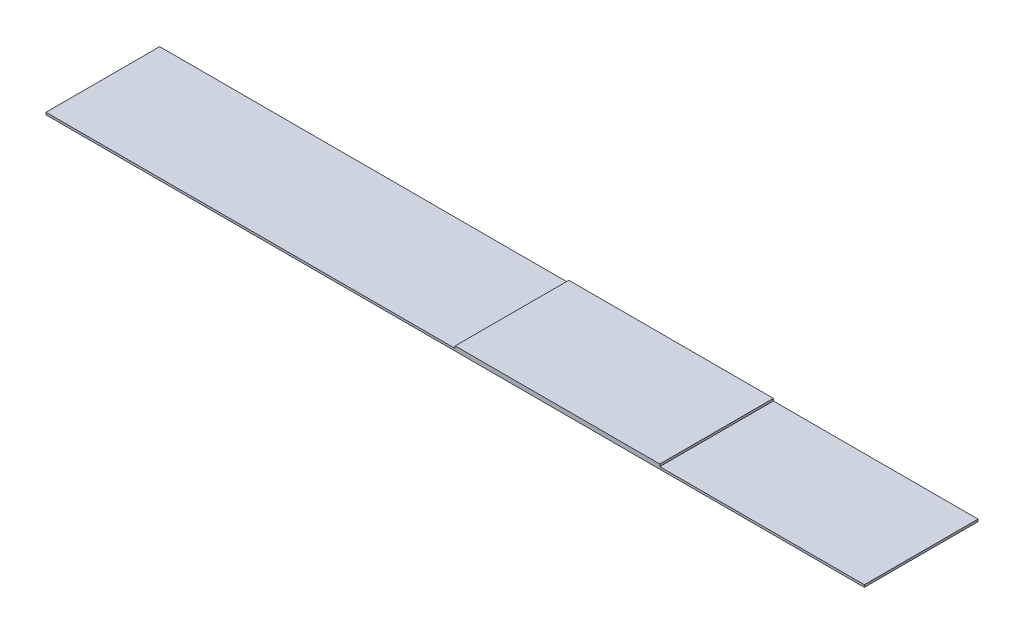
ISO-10303-21;
HEADER;
FILE_DESCRIPTION(('STEP AP214'),'2;1');
FILE_NAME('part.step','',(''),(''),'','','');
FILE_SCHEMA(('AUTOMOTIVE_DESIGN { 1 0 10303 214 1 1 1 1 }'));
ENDSEC;
DATA;
#1=APPLICATION_CONTEXT('core data for automotive mechanical design processes');
#2=APPLICATION_PROTOCOL_DEFINITION('international standard','automotive_design',2000,#1);
#3=PRODUCT_CONTEXT('',#1,'mechanical');
#4=PRODUCT('Part','Part','',(#3));
#5=PRODUCT_RELATED_PRODUCT_CATEGORY('part','',(#4));
#6=PRODUCT_DEFINITION_FORMATION('','',#4);
#7=PRODUCT_DEFINITION_CONTEXT('part definition',#1,'design');
#8=PRODUCT_DEFINITION('design','',#6,#7);
#9=PRODUCT_DEFINITION_SHAPE('','',#8);
#10=(LENGTH_UNIT() NAMED_UNIT(*) SI_UNIT(.MILLI.,.METRE.));
#11=(NAMED_UNIT(*) PLANE_ANGLE_UNIT() SI_UNIT($,.RADIAN.));
#12=(NAMED_UNIT(*) SI_UNIT($,.STERADIAN.) SOLID_ANGLE_UNIT());
#13=UNCERTAINTY_MEASURE_WITH_UNIT(LENGTH_MEASURE(1.E-05),#10,'distance_accuracy_value','');
#14=(GEOMETRIC_REPRESENTATION_CONTEXT(3) GLOBAL_UNCERTAINTY_ASSIGNED_CONTEXT((#13)) GLOBAL_UNIT_ASSIGNED_CONTEXT((#10,
#11,#12)) REPRESENTATION_CONTEXT('',''));
#15=CARTESIAN_POINT('',(0.,0.,0.));
#16=DIRECTION('',(0.,0.,1.));
#17=DIRECTION('',(1.,0.,0.));
#18=AXIS2_PLACEMENT_3D('',#15,#16,#17);
#19=CARTESIAN_POINT('',(0.,0.1,0.));
#20=DIRECTION('',(0.,-1.,0.));
#21=DIRECTION('',(0.,0.,-1.));
#22=AXIS2_PLACEMENT_3D('',#19,#20,#21);
#23=PLANE('',#22);
#24=DIRECTION('',(0.,0.,1.));
#25=VECTOR('',#24,1.);
#26=CARTESIAN_POINT('',(0.,0.1,-2.5));
#27=LINE('',#26,#25);
#28=CARTESIAN_POINT('',(0.,0.1,-2.5));
#29=VERTEX_POINT('',#28);
#30=CARTESIAN_POINT('',(0.,0.1,2.5));
#31=VERTEX_POINT('',#30);
#32=EDGE_CURVE('E120',#29,#31,#27,.T.);
#33=ORIENTED_EDGE('',*,*,#32,.F.);
#34=DIRECTION('',(-1.,0.,0.));
#35=VECTOR('',#34,1.);
#36=CARTESIAN_POINT('',(-18.,0.1,-2.5));
#37=LINE('',#36,#35);
#38=CARTESIAN_POINT('',(-18.,0.1,-2.5));
#39=VERTEX_POINT('',#38);
#40=EDGE_CURVE('E133',#29,#39,#37,.T.);
#41=ORIENTED_EDGE('',*,*,#40,.T.);
#42=DIRECTION('',(0.,0.,1.));
#43=VECTOR('',#42,1.);
#44=CARTESIAN_POINT('',(-18.,0.1,2.5));
#45=LINE('',#44,#43);
#46=CARTESIAN_POINT('',(-18.,0.1,2.5));
#47=VERTEX_POINT('',#46);
#48=EDGE_CURVE('E137',#39,#47,#45,.T.);
#49=ORIENTED_EDGE('',*,*,#48,.T.);
#50=DIRECTION('',(1.,0.,0.));
#51=VECTOR('',#50,1.);
#52=CARTESIAN_POINT('',(-18.,0.1,2.5));
#53=LINE('',#52,#51);
#54=EDGE_CURVE('E57',#47,#31,#53,.T.);
#55=ORIENTED_EDGE('',*,*,#54,.T.);
#56=EDGE_LOOP('',(#33,#41,#49,#55));
#57=FACE_BOUND('',#56,.T.);
#58=ADVANCED_FACE('F34',(#57),#23,.F.);
#59=DIRECTION('',(0.,0.,-1.));
#60=VECTOR('',#59,1.);
#61=CARTESIAN_POINT('',(9.,0.1,-2.5));
#62=LINE('',#61,#60);
#63=CARTESIAN_POINT('',(9.,0.1,2.5));
#64=VERTEX_POINT('',#63);
#65=CARTESIAN_POINT('',(9.,0.1,-2.5));
#66=VERTEX_POINT('',#65);
#67=EDGE_CURVE('E49',#64,#66,#62,.T.);
#68=ORIENTED_EDGE('',*,*,#67,.F.);
#69=CARTESIAN_POINT('',(18.,0.1,2.5));
#70=VERTEX_POINT('',#69);
#71=EDGE_CURVE('E139',#64,#70,#53,.T.);
#72=ORIENTED_EDGE('',*,*,#71,.T.);
#73=DIRECTION('',(0.,0.,-1.));
#74=VECTOR('',#73,1.);
#75=CARTESIAN_POINT('',(18.,0.1,2.5));
#76=LINE('',#75,#74);
#77=CARTESIAN_POINT('',(18.,0.1,-2.5));
#78=VERTEX_POINT('',#77);
#79=EDGE_CURVE('E130',#70,#78,#76,.T.);
#80=ORIENTED_EDGE('',*,*,#79,.T.);
#81=EDGE_CURVE('E135',#78,#66,#37,.T.);
#82=ORIENTED_EDGE('',*,*,#81,.T.);
#83=EDGE_LOOP('',(#68,#72,#80,#82));
#84=FACE_BOUND('',#83,.T.);
#85=ADVANCED_FACE('F167',(#84),#23,.F.);
#86=CARTESIAN_POINT('',(18.,0.1,2.5));
#87=DIRECTION('',(-1.,0.,0.));
#88=DIRECTION('',(0.,0.,1.));
#89=AXIS2_PLACEMENT_3D('',#86,#87,#88);
#90=PLANE('',#89);
#91=DIRECTION('',(0.,0.,-1.));
#92=VECTOR('',#91,1.);
#93=CARTESIAN_POINT('',(18.,0.,2.5));
#94=LINE('',#93,#92);
#95=CARTESIAN_POINT('',(18.,0.,2.5));
#96=VERTEX_POINT('',#95);
#97=CARTESIAN_POINT('',(18.,0.,-2.5));
#98=VERTEX_POINT('',#97);
#99=EDGE_CURVE('E121',#96,#98,#94,.T.);
#100=ORIENTED_EDGE('',*,*,#99,.T.);
#101=DIRECTION('',(0.,-1.,0.));
#102=VECTOR('',#101,1.);
#103=CARTESIAN_POINT('',(18.,0.1,-2.5));
#104=LINE('',#103,#102);
#105=EDGE_CURVE('E11',#78,#98,#104,.T.);
#106=ORIENTED_EDGE('',*,*,#105,.F.);
#107=ORIENTED_EDGE('',*,*,#79,.F.);
#108=DIRECTION('',(0.,-1.,0.));
#109=VECTOR('',#108,1.);
#110=CARTESIAN_POINT('',(18.,0.1,2.5));
#111=LINE('',#110,#109);
#112=EDGE_CURVE('E140',#70,#96,#111,.T.);
#113=ORIENTED_EDGE('',*,*,#112,.T.);
#114=EDGE_LOOP('',(#100,#106,#107,#113));
#115=FACE_BOUND('',#114,.T.);
#116=ADVANCED_FACE('F36',(#115),#90,.F.);
#117=CARTESIAN_POINT('',(-18.,0.1,-2.5));
#118=DIRECTION('',(0.,0.,1.));
#119=DIRECTION('',(1.,0.,0.));
#120=AXIS2_PLACEMENT_3D('',#117,#118,#119);
#121=PLANE('',#120);
#122=DIRECTION('',(-1.,0.,0.));
#123=VECTOR('',#122,1.);
#124=CARTESIAN_POINT('',(-18.,0.,-2.5));
#125=LINE('',#124,#123);
#126=CARTESIAN_POINT('',(-18.,0.,-2.5));
#127=VERTEX_POINT('',#126);
#128=EDGE_CURVE('E124',#98,#127,#125,.T.);
#129=ORIENTED_EDGE('',*,*,#128,.T.);
#130=DIRECTION('',(0.,-1.,0.));
#131=VECTOR('',#130,1.);
#132=CARTESIAN_POINT('',(-18.,0.1,-2.5));
#133=LINE('',#132,#131);
#134=EDGE_CURVE('E42',#39,#127,#133,.T.);
#135=ORIENTED_EDGE('',*,*,#134,.F.);
#136=ORIENTED_EDGE('',*,*,#40,.F.);
#137=DIRECTION('',(0.,-1.,0.));
#138=VECTOR('',#137,1.);
#139=CARTESIAN_POINT('',(0.,0.2,-2.5));
#140=LINE('',#139,#138);
#141=CARTESIAN_POINT('',(0.,0.2,-2.5));
#142=VERTEX_POINT('',#141);
#143=EDGE_CURVE('E173',#142,#29,#140,.T.);
#144=ORIENTED_EDGE('',*,*,#143,.F.);
#145=DIRECTION('',(-1.,0.,0.));
#146=VECTOR('',#145,1.);
#147=CARTESIAN_POINT('',(0.,0.2,-2.5));
#148=LINE('',#147,#146);
#149=CARTESIAN_POINT('',(9.,0.2,-2.5));
#150=VERTEX_POINT('',#149);
#151=EDGE_CURVE('E114',#150,#142,#148,.T.);
#152=ORIENTED_EDGE('',*,*,#151,.F.);
#153=DIRECTION('',(0.,-1.,0.));
#154=VECTOR('',#153,1.);
#155=CARTESIAN_POINT('',(9.,0.2,-2.5));
#156=LINE('',#155,#154);
#157=EDGE_CURVE('E126',#150,#66,#156,.T.);
#158=ORIENTED_EDGE('',*,*,#157,.T.);
#159=ORIENTED_EDGE('',*,*,#81,.F.);
#160=ORIENTED_EDGE('',*,*,#105,.T.);
#161=EDGE_LOOP('',(#129,#135,#136,#144,#152,#158,#159,#160));
#162=FACE_BOUND('',#161,.T.);
#163=ADVANCED_FACE('F178',(#162),#121,.F.);
#164=CARTESIAN_POINT('',(-18.,0.1,2.5));
#165=DIRECTION('',(1.,0.,0.));
#166=DIRECTION('',(0.,0.,-1.));
#167=AXIS2_PLACEMENT_3D('',#164,#165,#166);
#168=PLANE('',#167);
#169=DIRECTION('',(0.,0.,1.));
#170=VECTOR('',#169,1.);
#171=CARTESIAN_POINT('',(-18.,0.,2.5));
#172=LINE('',#171,#170);
#173=CARTESIAN_POINT('',(-18.,0.,2.5));
#174=VERTEX_POINT('',#173);
#175=EDGE_CURVE('E143',#127,#174,#172,.T.);
#176=ORIENTED_EDGE('',*,*,#175,.T.);
#177=DIRECTION('',(0.,-1.,0.));
#178=VECTOR('',#177,1.);
#179=CARTESIAN_POINT('',(-18.,0.1,2.5));
#180=LINE('',#179,#178);
#181=EDGE_CURVE('E148',#47,#174,#180,.T.);
#182=ORIENTED_EDGE('',*,*,#181,.F.);
#183=ORIENTED_EDGE('',*,*,#48,.F.);
#184=ORIENTED_EDGE('',*,*,#134,.T.);
#185=EDGE_LOOP('',(#176,#182,#183,#184));
#186=FACE_BOUND('',#185,.T.);
#187=ADVANCED_FACE('F155',(#186),#168,.F.);
#188=CARTESIAN_POINT('',(-18.,0.1,2.5));
#189=DIRECTION('',(0.,0.,-1.));
#190=DIRECTION('',(-1.,0.,0.));
#191=AXIS2_PLACEMENT_3D('',#188,#189,#190);
#192=PLANE('',#191);
#193=DIRECTION('',(1.,0.,0.));
#194=VECTOR('',#193,1.);
#195=CARTESIAN_POINT('',(-18.,0.,2.5));
#196=LINE('',#195,#194);
#197=EDGE_CURVE('E134',#174,#96,#196,.T.);
#198=ORIENTED_EDGE('',*,*,#197,.T.);
#199=ORIENTED_EDGE('',*,*,#112,.F.);
#200=ORIENTED_EDGE('',*,*,#71,.F.);
#201=DIRECTION('',(0.,-1.,0.));
#202=VECTOR('',#201,1.);
#203=CARTESIAN_POINT('',(9.,0.2,2.5));
#204=LINE('',#203,#202);
#205=CARTESIAN_POINT('',(9.,0.2,2.5));
#206=VERTEX_POINT('',#205);
#207=EDGE_CURVE('E105',#206,#64,#204,.T.);
#208=ORIENTED_EDGE('',*,*,#207,.F.);
#209=DIRECTION('',(1.,0.,0.));
#210=VECTOR('',#209,1.);
#211=CARTESIAN_POINT('',(0.,0.2,2.5));
#212=LINE('',#211,#210);
#213=CARTESIAN_POINT('',(0.,0.2,2.5));
#214=VERTEX_POINT('',#213);
#215=EDGE_CURVE('E98',#214,#206,#212,.T.);
#216=ORIENTED_EDGE('',*,*,#215,.F.);
#217=DIRECTION('',(0.,-1.,0.));
#218=VECTOR('',#217,1.);
#219=CARTESIAN_POINT('',(0.,0.2,2.5));
#220=LINE('',#219,#218);
#221=EDGE_CURVE('E102',#214,#31,#220,.T.);
#222=ORIENTED_EDGE('',*,*,#221,.T.);
#223=ORIENTED_EDGE('',*,*,#54,.F.);
#224=ORIENTED_EDGE('',*,*,#181,.T.);
#225=EDGE_LOOP('',(#198,#199,#200,#208,#216,#222,#223,#224));
#226=FACE_BOUND('',#225,.T.);
#227=ADVANCED_FACE('F100',(#226),#192,.F.);
#228=CARTESIAN_POINT('',(0.,0.,0.));
#229=DIRECTION('',(0.,-1.,0.));
#230=DIRECTION('',(0.,0.,-1.));
#231=AXIS2_PLACEMENT_3D('',#228,#229,#230);
#232=PLANE('',#231);
#233=ORIENTED_EDGE('',*,*,#99,.F.);
#234=ORIENTED_EDGE('',*,*,#197,.F.);
#235=ORIENTED_EDGE('',*,*,#175,.F.);
#236=ORIENTED_EDGE('',*,*,#128,.F.);
#237=EDGE_LOOP('',(#233,#234,#235,#236));
#238=FACE_BOUND('',#237,.T.);
#239=ADVANCED_FACE('F162',(#238),#232,.T.);
#240=CARTESIAN_POINT('',(0.,0.2,-2.5));
#241=DIRECTION('',(1.,0.,0.));
#242=DIRECTION('',(0.,0.,-1.));
#243=AXIS2_PLACEMENT_3D('',#240,#241,#242);
#244=PLANE('',#243);
#245=ORIENTED_EDGE('',*,*,#32,.T.);
#246=ORIENTED_EDGE('',*,*,#221,.F.);
#247=DIRECTION('',(0.,0.,1.));
#248=VECTOR('',#247,1.);
#249=CARTESIAN_POINT('',(0.,0.2,-2.5));
#250=LINE('',#249,#248);
#251=EDGE_CURVE('E109',#142,#214,#250,.T.);
#252=ORIENTED_EDGE('',*,*,#251,.F.);
#253=ORIENTED_EDGE('',*,*,#143,.T.);
#254=EDGE_LOOP('',(#245,#246,#252,#253));
#255=FACE_BOUND('',#254,.T.);
#256=ADVANCED_FACE('F119',(#255),#244,.F.);
#257=CARTESIAN_POINT('',(9.,0.2,-2.5));
#258=DIRECTION('',(-1.,0.,0.));
#259=DIRECTION('',(0.,0.,1.));
#260=AXIS2_PLACEMENT_3D('',#257,#258,#259);
#261=PLANE('',#260);
#262=ORIENTED_EDGE('',*,*,#67,.T.);
#263=ORIENTED_EDGE('',*,*,#157,.F.);
#264=DIRECTION('',(0.,0.,-1.));
#265=VECTOR('',#264,1.);
#266=CARTESIAN_POINT('',(9.,0.2,-2.5));
#267=LINE('',#266,#265);
#268=EDGE_CURVE('E108',#206,#150,#267,.T.);
#269=ORIENTED_EDGE('',*,*,#268,.F.);
#270=ORIENTED_EDGE('',*,*,#207,.T.);
#271=EDGE_LOOP('',(#262,#263,#269,#270));
#272=FACE_BOUND('',#271,.T.);
#273=ADVANCED_FACE('F169',(#272),#261,.F.);
#274=CARTESIAN_POINT('',(0.,0.2,0.));
#275=DIRECTION('',(0.,1.,0.));
#276=DIRECTION('',(0.,0.,1.));
#277=AXIS2_PLACEMENT_3D('',#274,#275,#276);
#278=PLANE('',#277);
#279=ORIENTED_EDGE('',*,*,#251,.T.);
#280=ORIENTED_EDGE('',*,*,#215,.T.);
#281=ORIENTED_EDGE('',*,*,#268,.T.);
#282=ORIENTED_EDGE('',*,*,#151,.T.);
#283=EDGE_LOOP('',(#279,#280,#281,#282));
#284=FACE_BOUND('',#283,.T.);
#285=ADVANCED_FACE('F112',(#284),#278,.T.);
#286=CLOSED_SHELL('',(#58,#85,#116,#163,#187,#227,#239,#256,#273,#285));
#287=MANIFOLD_SOLID_BREP('B2',#286);
#288=ADVANCED_BREP_SHAPE_REPRESENTATION('',(#18,#287),#14);
#289=SHAPE_DEFINITION_REPRESENTATION(#9,#288);
ENDSEC;
END-ISO-10303-21;
